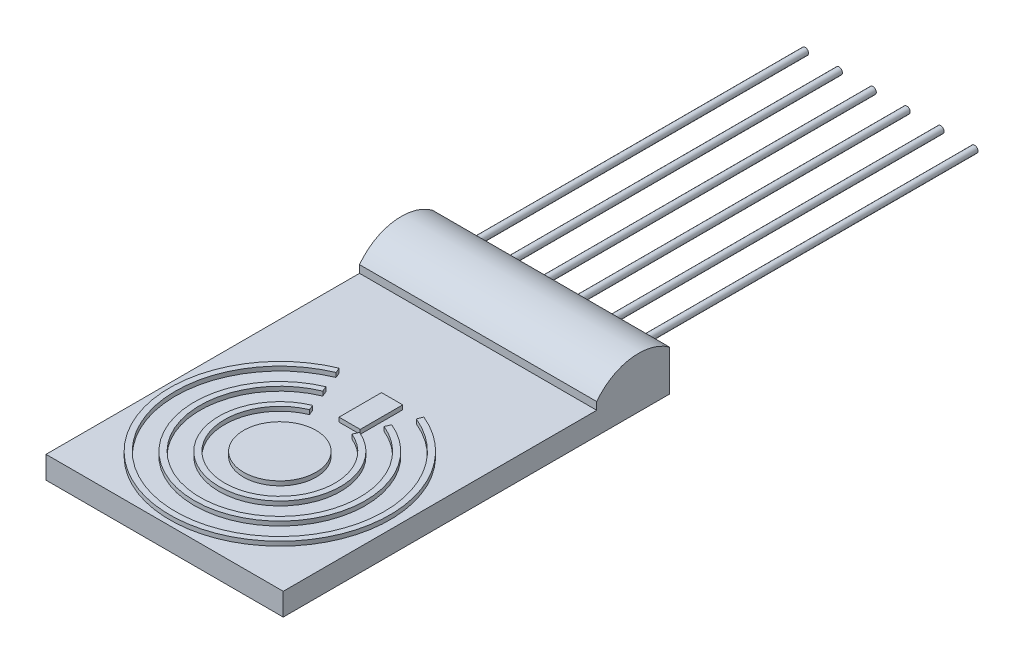
ISO-10303-21;
HEADER;
FILE_DESCRIPTION(('STEP AP214'),'2;1');
FILE_NAME('part.step','',(''),(''),'','','');
FILE_SCHEMA(('AUTOMOTIVE_DESIGN { 1 0 10303 214 1 1 1 1 }'));
ENDSEC;
DATA;
#1=APPLICATION_CONTEXT('core data for automotive mechanical design processes');
#2=APPLICATION_PROTOCOL_DEFINITION('international standard','automotive_design',2000,#1);
#3=PRODUCT_CONTEXT('',#1,'mechanical');
#4=PRODUCT('Part','Part','',(#3));
#5=PRODUCT_RELATED_PRODUCT_CATEGORY('part','',(#4));
#6=PRODUCT_DEFINITION_FORMATION('','',#4);
#7=PRODUCT_DEFINITION_CONTEXT('part definition',#1,'design');
#8=PRODUCT_DEFINITION('design','',#6,#7);
#9=PRODUCT_DEFINITION_SHAPE('','',#8);
#10=(LENGTH_UNIT() NAMED_UNIT(*) SI_UNIT(.MILLI.,.METRE.));
#11=(NAMED_UNIT(*) PLANE_ANGLE_UNIT() SI_UNIT($,.RADIAN.));
#12=(NAMED_UNIT(*) SI_UNIT($,.STERADIAN.) SOLID_ANGLE_UNIT());
#13=UNCERTAINTY_MEASURE_WITH_UNIT(LENGTH_MEASURE(1.E-05),#10,'distance_accuracy_value','');
#14=(GEOMETRIC_REPRESENTATION_CONTEXT(3) GLOBAL_UNCERTAINTY_ASSIGNED_CONTEXT((#13)) GLOBAL_UNIT_ASSIGNED_CONTEXT((#10,
#11,#12)) REPRESENTATION_CONTEXT('',''));
#15=CARTESIAN_POINT('',(0.,0.,0.));
#16=DIRECTION('',(0.,0.,1.));
#17=DIRECTION('',(1.,0.,0.));
#18=AXIS2_PLACEMENT_3D('',#15,#16,#17);
#19=CARTESIAN_POINT('',(0.,0.6604,0.));
#20=DIRECTION('',(0.,1.,0.));
#21=DIRECTION('',(0.,0.,1.));
#22=AXIS2_PLACEMENT_3D('',#19,#20,#21);
#23=PLANE('',#22);
#24=CARTESIAN_POINT('',(0.,0.6604,-3.4));
#25=DIRECTION('',(0.,1.,0.));
#26=DIRECTION('',(0.,0.,1.));
#27=AXIS2_PLACEMENT_3D('',#24,#25,#26);
#28=CIRCLE('',#27,1.07);
#29=CARTESIAN_POINT('',(0.,0.6604,-2.33));
#30=VERTEX_POINT('',#29);
#31=EDGE_CURVE('E300',#30,#30,#28,.T.);
#32=ORIENTED_EDGE('',*,*,#31,.F.);
#33=EDGE_LOOP('',(#32));
#34=FACE_BOUND('',#33,.T.);
#35=DIRECTION('',(0.,0.,-1.));
#36=VECTOR('',#35,1.);
#37=CARTESIAN_POINT('',(3.5,0.6604,-11.4));
#38=LINE('',#37,#36);
#39=CARTESIAN_POINT('',(3.5,0.6604,0.));
#40=VERTEX_POINT('',#39);
#41=CARTESIAN_POINT('',(3.5,0.6604,-9.25));
#42=VERTEX_POINT('',#41);
#43=EDGE_CURVE('E330',#40,#42,#38,.T.);
#44=ORIENTED_EDGE('',*,*,#43,.T.);
#45=DIRECTION('',(-1.,0.,0.));
#46=VECTOR('',#45,1.);
#47=CARTESIAN_POINT('',(5.80812221513507,0.6604,-9.25));
#48=LINE('',#47,#46);
#49=CARTESIAN_POINT('',(-3.5,0.6604,-9.25));
#50=VERTEX_POINT('',#49);
#51=EDGE_CURVE('E316',#42,#50,#48,.T.);
#52=ORIENTED_EDGE('',*,*,#51,.T.);
#53=DIRECTION('',(0.,0.,1.));
#54=VECTOR('',#53,1.);
#55=CARTESIAN_POINT('',(-3.5,0.6604,-11.4));
#56=LINE('',#55,#54);
#57=CARTESIAN_POINT('',(-3.5,0.6604,0.));
#58=VERTEX_POINT('',#57);
#59=EDGE_CURVE('E325',#50,#58,#56,.T.);
#60=ORIENTED_EDGE('',*,*,#59,.T.);
#61=DIRECTION('',(1.,0.,0.));
#62=VECTOR('',#61,1.);
#63=CARTESIAN_POINT('',(-3.5,0.6604,0.));
#64=LINE('',#63,#62);
#65=EDGE_CURVE('E327',#58,#40,#64,.T.);
#66=ORIENTED_EDGE('',*,*,#65,.T.);
#67=EDGE_LOOP('',(#44,#52,#60,#66));
#68=FACE_BOUND('',#67,.T.);
#69=DIRECTION('',(-0.384615384615385,0.,-0.923076923076923));
#70=VECTOR('',#69,1.);
#71=CARTESIAN_POINT('',(-0.625641058717949,0.6604,-4.90153854092308));
#72=LINE('',#71,#70);
#73=CARTESIAN_POINT('',(-0.625641058717949,0.6604,-4.90153854092308));
#74=VERTEX_POINT('',#73);
#75=CARTESIAN_POINT('',(-0.691025641025641,0.6604,-5.05846153846154));
#76=VERTEX_POINT('',#75);
#77=EDGE_CURVE('E285',#74,#76,#72,.T.);
#78=ORIENTED_EDGE('',*,*,#77,.F.);
#79=CARTESIAN_POINT('',(0.,0.6604,-3.4));
#80=DIRECTION('',(0.,-1.,0.));
#81=DIRECTION('',(0.,0.,1.));
#82=AXIS2_PLACEMENT_3D('',#79,#80,#81);
#83=CIRCLE('',#82,1.62666675266667);
#84=CARTESIAN_POINT('',(0.625641058717949,0.6604,-4.90153854092308));
#85=VERTEX_POINT('',#84);
#86=EDGE_CURVE('E271',#85,#74,#83,.T.);
#87=ORIENTED_EDGE('',*,*,#86,.F.);
#88=DIRECTION('',(-0.384615384615385,0.,0.923076923076923));
#89=VECTOR('',#88,1.);
#90=CARTESIAN_POINT('',(0.625641058717949,0.6604,-4.90153854092308));
#91=LINE('',#90,#89);
#92=CARTESIAN_POINT('',(0.691025641025641,0.6604,-5.05846153846154));
#93=VERTEX_POINT('',#92);
#94=EDGE_CURVE('E276',#93,#85,#91,.T.);
#95=ORIENTED_EDGE('',*,*,#94,.F.);
#96=CARTESIAN_POINT('',(0.,0.6604,-3.4));
#97=DIRECTION('',(0.,1.,0.));
#98=DIRECTION('',(0.,0.,1.));
#99=AXIS2_PLACEMENT_3D('',#96,#97,#98);
#100=CIRCLE('',#99,1.79666666666667);
#101=EDGE_CURVE('E287',#76,#93,#100,.T.);
#102=ORIENTED_EDGE('',*,*,#101,.F.);
#103=EDGE_LOOP('',(#78,#87,#95,#102));
#104=FACE_BOUND('',#103,.T.);
#105=DIRECTION('',(-0.384615384615382,0.,-0.923076923076924));
#106=VECTOR('',#105,1.);
#107=CARTESIAN_POINT('',(-0.905128238205129,0.6604,-5.57230777169231));
#108=LINE('',#107,#106);
#109=CARTESIAN_POINT('',(-0.905128238205129,0.6604,-5.57230777169231));
#110=VERTEX_POINT('',#109);
#111=CARTESIAN_POINT('',(-0.970512820512821,0.6604,-5.72923076923077));
#112=VERTEX_POINT('',#111);
#113=EDGE_CURVE('E256',#110,#112,#108,.T.);
#114=ORIENTED_EDGE('',*,*,#113,.F.);
#115=CARTESIAN_POINT('',(0.,0.6604,-3.4));
#116=DIRECTION('',(0.,-1.,0.));
#117=DIRECTION('',(0.,0.,1.));
#118=AXIS2_PLACEMENT_3D('',#115,#116,#117);
#119=CIRCLE('',#118,2.35333341933333);
#120=CARTESIAN_POINT('',(0.905128238205129,0.6604,-5.57230777169231));
#121=VERTEX_POINT('',#120);
#122=EDGE_CURVE('E242',#121,#110,#119,.T.);
#123=ORIENTED_EDGE('',*,*,#122,.F.);
#124=DIRECTION('',(-0.384615384615383,0.,0.923076923076924));
#125=VECTOR('',#124,1.);
#126=CARTESIAN_POINT('',(0.905128238205129,0.6604,-5.57230777169231));
#127=LINE('',#126,#125);
#128=CARTESIAN_POINT('',(0.970512820512821,0.6604,-5.72923076923077));
#129=VERTEX_POINT('',#128);
#130=EDGE_CURVE('E247',#129,#121,#127,.T.);
#131=ORIENTED_EDGE('',*,*,#130,.F.);
#132=CARTESIAN_POINT('',(0.,0.6604,-3.4));
#133=DIRECTION('',(0.,1.,0.));
#134=DIRECTION('',(0.,0.,1.));
#135=AXIS2_PLACEMENT_3D('',#132,#133,#134);
#136=CIRCLE('',#135,2.52333333333333);
#137=EDGE_CURVE('E258',#112,#129,#136,.T.);
#138=ORIENTED_EDGE('',*,*,#137,.F.);
#139=EDGE_LOOP('',(#114,#123,#131,#138));
#140=FACE_BOUND('',#139,.T.);
#141=DIRECTION('',(-0.384615384615382,0.,-0.923076923076924));
#142=VECTOR('',#141,1.);
#143=CARTESIAN_POINT('',(-1.18461541769231,0.6604,-6.24307700246154));
#144=LINE('',#143,#142);
#145=CARTESIAN_POINT('',(-1.18461541769231,0.6604,-6.24307700246154));
#146=VERTEX_POINT('',#145);
#147=CARTESIAN_POINT('',(-1.25,0.6604,-6.4));
#148=VERTEX_POINT('',#147);
#149=EDGE_CURVE('E214',#146,#148,#144,.T.);
#150=ORIENTED_EDGE('',*,*,#149,.F.);
#151=CARTESIAN_POINT('',(0.,0.6604,-3.4));
#152=DIRECTION('',(0.,-1.,0.));
#153=DIRECTION('',(0.,0.,1.));
#154=AXIS2_PLACEMENT_3D('',#151,#152,#153);
#155=CIRCLE('',#154,3.080000086);
#156=CARTESIAN_POINT('',(1.18461541769231,0.6604,-6.24307700246154));
#157=VERTEX_POINT('',#156);
#158=EDGE_CURVE('E211',#157,#146,#155,.T.);
#159=ORIENTED_EDGE('',*,*,#158,.F.);
#160=DIRECTION('',(-0.384615384615384,0.,0.923076923076923));
#161=VECTOR('',#160,1.);
#162=CARTESIAN_POINT('',(1.18461541769231,0.6604,-6.24307700246154));
#163=LINE('',#162,#161);
#164=CARTESIAN_POINT('',(1.25,0.6604,-6.4));
#165=VERTEX_POINT('',#164);
#166=EDGE_CURVE('E223',#165,#157,#163,.T.);
#167=ORIENTED_EDGE('',*,*,#166,.F.);
#168=CARTESIAN_POINT('',(0.,0.6604,-3.4));
#169=DIRECTION('',(0.,1.,0.));
#170=DIRECTION('',(0.,0.,1.));
#171=AXIS2_PLACEMENT_3D('',#168,#169,#170);
#172=CIRCLE('',#171,3.25);
#173=EDGE_CURVE('E231',#148,#165,#172,.T.);
#174=ORIENTED_EDGE('',*,*,#173,.F.);
#175=EDGE_LOOP('',(#150,#159,#167,#174));
#176=FACE_BOUND('',#175,.T.);
#177=DIRECTION('',(1.,0.,0.));
#178=VECTOR('',#177,1.);
#179=CARTESIAN_POINT('',(0.,0.6604,-5.14588991340849));
#180=LINE('',#179,#178);
#181=CARTESIAN_POINT('',(0.,0.6604,-5.14588991340849));
#182=VERTEX_POINT('',#181);
#183=CARTESIAN_POINT('',(0.625641058717949,0.6604,-5.14588991340849));
#184=VERTEX_POINT('',#183);
#185=EDGE_CURVE('E583',#182,#184,#180,.T.);
#186=ORIENTED_EDGE('',*,*,#185,.F.);
#187=DIRECTION('',(0.,0.,1.));
#188=VECTOR('',#187,1.);
#189=CARTESIAN_POINT('',(0.,0.6604,-6.4));
#190=LINE('',#189,#188);
#191=CARTESIAN_POINT('',(0.,0.6604,-6.4));
#192=VERTEX_POINT('',#191);
#193=EDGE_CURVE('E209',#192,#182,#190,.T.);
#194=ORIENTED_EDGE('',*,*,#193,.F.);
#195=DIRECTION('',(-1.,0.,0.));
#196=VECTOR('',#195,1.);
#197=CARTESIAN_POINT('',(0.,0.6604,-6.4));
#198=LINE('',#197,#196);
#199=CARTESIAN_POINT('',(0.625641058717949,0.6604,-6.4));
#200=VERTEX_POINT('',#199);
#201=EDGE_CURVE('E205',#200,#192,#198,.T.);
#202=ORIENTED_EDGE('',*,*,#201,.F.);
#203=DIRECTION('',(0.,0.,-1.));
#204=VECTOR('',#203,1.);
#205=CARTESIAN_POINT('',(0.625641058717949,0.6604,-6.4));
#206=LINE('',#205,#204);
#207=EDGE_CURVE('E585',#184,#200,#206,.T.);
#208=ORIENTED_EDGE('',*,*,#207,.F.);
#209=EDGE_LOOP('',(#186,#194,#202,#208));
#210=FACE_BOUND('',#209,.T.);
#211=ADVANCED_FACE('F36',(#34,#68,#104,#140,#176,#210),#23,.T.);
#212=CARTESIAN_POINT('',(-3.5,0.6604,-11.4));
#213=DIRECTION('',(1.,0.,0.));
#214=DIRECTION('',(0.,0.,-1.));
#215=AXIS2_PLACEMENT_3D('',#212,#213,#214);
#216=PLANE('',#215);
#217=DIRECTION('',(0.,0.,1.));
#218=VECTOR('',#217,1.);
#219=CARTESIAN_POINT('',(-3.5,0.,-11.4));
#220=LINE('',#219,#218);
#221=CARTESIAN_POINT('',(-3.5,0.,-11.4));
#222=VERTEX_POINT('',#221);
#223=CARTESIAN_POINT('',(-3.5,0.,0.));
#224=VERTEX_POINT('',#223);
#225=EDGE_CURVE('E324',#222,#224,#220,.T.);
#226=ORIENTED_EDGE('',*,*,#225,.T.);
#227=DIRECTION('',(0.,-1.,0.));
#228=VECTOR('',#227,1.);
#229=CARTESIAN_POINT('',(-3.5,0.6604,0.));
#230=LINE('',#229,#228);
#231=EDGE_CURVE('E349',#58,#224,#230,.T.);
#232=ORIENTED_EDGE('',*,*,#231,.F.);
#233=ORIENTED_EDGE('',*,*,#59,.F.);
#234=DIRECTION('',(0.,1.,0.));
#235=VECTOR('',#234,1.);
#236=CARTESIAN_POINT('',(-3.5,0.6604,-9.25));
#237=LINE('',#236,#235);
#238=CARTESIAN_POINT('',(-3.5,0.88367644167775,-9.25));
#239=VERTEX_POINT('',#238);
#240=EDGE_CURVE('E304',#50,#239,#237,.T.);
#241=ORIENTED_EDGE('',*,*,#240,.T.);
#242=CARTESIAN_POINT('',(-3.5,-0.045461998302742,-10.4849714764109));
#243=DIRECTION('',(-1.,0.,0.));
#244=DIRECTION('',(0.,0.,-1.));
#245=AXIS2_PLACEMENT_3D('',#242,#243,#244);
#246=CIRCLE('',#245,1.54546199830274);
#247=CARTESIAN_POINT('',(-3.5,1.2,-11.4));
#248=VERTEX_POINT('',#247);
#249=EDGE_CURVE('E313',#239,#248,#246,.T.);
#250=ORIENTED_EDGE('',*,*,#249,.T.);
#251=DIRECTION('',(0.,-1.,0.));
#252=VECTOR('',#251,1.);
#253=CARTESIAN_POINT('',(-3.5,0.6604,-11.4));
#254=LINE('',#253,#252);
#255=EDGE_CURVE('E333',#248,#222,#254,.T.);
#256=ORIENTED_EDGE('',*,*,#255,.T.);
#257=EDGE_LOOP('',(#226,#232,#233,#241,#250,#256));
#258=FACE_BOUND('',#257,.T.);
#259=ADVANCED_FACE('F38',(#258),#216,.F.);
#260=CARTESIAN_POINT('',(-3.5,0.6604,0.));
#261=DIRECTION('',(0.,0.,-1.));
#262=DIRECTION('',(-1.,0.,0.));
#263=AXIS2_PLACEMENT_3D('',#260,#261,#262);
#264=PLANE('',#263);
#265=DIRECTION('',(1.,0.,0.));
#266=VECTOR('',#265,1.);
#267=CARTESIAN_POINT('',(-3.5,0.,0.));
#268=LINE('',#267,#266);
#269=CARTESIAN_POINT('',(3.5,0.,0.));
#270=VERTEX_POINT('',#269);
#271=EDGE_CURVE('E336',#224,#270,#268,.T.);
#272=ORIENTED_EDGE('',*,*,#271,.T.);
#273=DIRECTION('',(0.,-1.,0.));
#274=VECTOR('',#273,1.);
#275=CARTESIAN_POINT('',(3.5,0.6604,0.));
#276=LINE('',#275,#274);
#277=EDGE_CURVE('E346',#40,#270,#276,.T.);
#278=ORIENTED_EDGE('',*,*,#277,.F.);
#279=ORIENTED_EDGE('',*,*,#65,.F.);
#280=ORIENTED_EDGE('',*,*,#231,.T.);
#281=EDGE_LOOP('',(#272,#278,#279,#280));
#282=FACE_BOUND('',#281,.T.);
#283=ADVANCED_FACE('F394',(#282),#264,.F.);
#284=CARTESIAN_POINT('',(3.5,0.6604,-11.4));
#285=DIRECTION('',(-1.,0.,0.));
#286=DIRECTION('',(0.,0.,1.));
#287=AXIS2_PLACEMENT_3D('',#284,#285,#286);
#288=PLANE('',#287);
#289=DIRECTION('',(0.,0.,-1.));
#290=VECTOR('',#289,1.);
#291=CARTESIAN_POINT('',(3.5,0.,-11.4));
#292=LINE('',#291,#290);
#293=CARTESIAN_POINT('',(3.5,0.,-11.4));
#294=VERTEX_POINT('',#293);
#295=EDGE_CURVE('E338',#270,#294,#292,.T.);
#296=ORIENTED_EDGE('',*,*,#295,.T.);
#297=DIRECTION('',(0.,-1.,0.));
#298=VECTOR('',#297,1.);
#299=CARTESIAN_POINT('',(3.5,0.6604,-11.4));
#300=LINE('',#299,#298);
#301=CARTESIAN_POINT('',(3.5,1.2,-11.4));
#302=VERTEX_POINT('',#301);
#303=EDGE_CURVE('E343',#302,#294,#300,.T.);
#304=ORIENTED_EDGE('',*,*,#303,.F.);
#305=CARTESIAN_POINT('',(3.5,-0.045461998302742,-10.4849714764109));
#306=DIRECTION('',(-1.,0.,0.));
#307=DIRECTION('',(0.,0.,1.));
#308=AXIS2_PLACEMENT_3D('',#305,#306,#307);
#309=CIRCLE('',#308,1.54546199830274);
#310=CARTESIAN_POINT('',(3.5,0.88367644167775,-9.25));
#311=VERTEX_POINT('',#310);
#312=EDGE_CURVE('E307',#302,#311,#309,.F.);
#313=ORIENTED_EDGE('',*,*,#312,.T.);
#314=DIRECTION('',(0.,-1.,0.));
#315=VECTOR('',#314,1.);
#316=CARTESIAN_POINT('',(3.5,0.6604,-9.25));
#317=LINE('',#316,#315);
#318=EDGE_CURVE('E309',#311,#42,#317,.T.);
#319=ORIENTED_EDGE('',*,*,#318,.T.);
#320=ORIENTED_EDGE('',*,*,#43,.F.);
#321=ORIENTED_EDGE('',*,*,#277,.T.);
#322=EDGE_LOOP('',(#296,#304,#313,#319,#320,#321));
#323=FACE_BOUND('',#322,.T.);
#324=ADVANCED_FACE('F372',(#323),#288,.F.);
#325=CARTESIAN_POINT('',(-3.5,0.6604,-11.4));
#326=DIRECTION('',(0.,0.,1.));
#327=DIRECTION('',(1.,0.,0.));
#328=AXIS2_PLACEMENT_3D('',#325,#326,#327);
#329=PLANE('',#328);
#330=CARTESIAN_POINT('',(-2.5,0.7604,-11.4));
#331=DIRECTION('',(0.,0.,1.));
#332=DIRECTION('',(1.,0.,0.));
#333=AXIS2_PLACEMENT_3D('',#330,#331,#332);
#334=CIRCLE('',#333,0.0999999999999999);
#335=CARTESIAN_POINT('',(-2.4,0.7604,-11.4));
#336=VERTEX_POINT('',#335);
#337=EDGE_CURVE('E11',#336,#336,#334,.F.);
#338=ORIENTED_EDGE('',*,*,#337,.F.);
#339=EDGE_LOOP('',(#338));
#340=FACE_BOUND('',#339,.T.);
#341=CARTESIAN_POINT('',(-1.5,0.7604,-11.4));
#342=DIRECTION('',(0.,0.,1.));
#343=DIRECTION('',(1.,0.,0.));
#344=AXIS2_PLACEMENT_3D('',#341,#342,#343);
#345=CIRCLE('',#344,0.1);
#346=CARTESIAN_POINT('',(-1.4,0.7604,-11.4));
#347=VERTEX_POINT('',#346);
#348=EDGE_CURVE('E44',#347,#347,#345,.F.);
#349=ORIENTED_EDGE('',*,*,#348,.F.);
#350=EDGE_LOOP('',(#349));
#351=FACE_BOUND('',#350,.T.);
#352=CARTESIAN_POINT('',(-0.5,0.7604,-11.4));
#353=DIRECTION('',(0.,0.,1.));
#354=DIRECTION('',(1.,0.,0.));
#355=AXIS2_PLACEMENT_3D('',#352,#353,#354);
#356=CIRCLE('',#355,0.1);
#357=CARTESIAN_POINT('',(-0.4,0.7604,-11.4));
#358=VERTEX_POINT('',#357);
#359=EDGE_CURVE('E361',#358,#358,#356,.F.);
#360=ORIENTED_EDGE('',*,*,#359,.F.);
#361=EDGE_LOOP('',(#360));
#362=FACE_BOUND('',#361,.T.);
#363=CARTESIAN_POINT('',(0.5,0.7604,-11.4));
#364=DIRECTION('',(0.,0.,1.));
#365=DIRECTION('',(1.,0.,0.));
#366=AXIS2_PLACEMENT_3D('',#363,#364,#365);
#367=CIRCLE('',#366,0.1);
#368=CARTESIAN_POINT('',(0.6,0.7604,-11.4));
#369=VERTEX_POINT('',#368);
#370=EDGE_CURVE('E358',#369,#369,#367,.F.);
#371=ORIENTED_EDGE('',*,*,#370,.F.);
#372=EDGE_LOOP('',(#371));
#373=FACE_BOUND('',#372,.T.);
#374=CARTESIAN_POINT('',(1.5,0.7604,-11.4));
#375=DIRECTION('',(0.,0.,1.));
#376=DIRECTION('',(1.,0.,0.));
#377=AXIS2_PLACEMENT_3D('',#374,#375,#376);
#378=CIRCLE('',#377,0.1);
#379=CARTESIAN_POINT('',(1.6,0.7604,-11.4));
#380=VERTEX_POINT('',#379);
#381=EDGE_CURVE('E355',#380,#380,#378,.F.);
#382=ORIENTED_EDGE('',*,*,#381,.F.);
#383=EDGE_LOOP('',(#382));
#384=FACE_BOUND('',#383,.T.);
#385=CARTESIAN_POINT('',(2.5,0.7604,-11.4));
#386=DIRECTION('',(0.,0.,1.));
#387=DIRECTION('',(1.,0.,0.));
#388=AXIS2_PLACEMENT_3D('',#385,#386,#387);
#389=CIRCLE('',#388,0.0999999999999999);
#390=CARTESIAN_POINT('',(2.6,0.7604,-11.4));
#391=VERTEX_POINT('',#390);
#392=EDGE_CURVE('E352',#391,#391,#389,.F.);
#393=ORIENTED_EDGE('',*,*,#392,.F.);
#394=EDGE_LOOP('',(#393));
#395=FACE_BOUND('',#394,.T.);
#396=DIRECTION('',(-1.,0.,0.));
#397=VECTOR('',#396,1.);
#398=CARTESIAN_POINT('',(-3.5,0.,-11.4));
#399=LINE('',#398,#397);
#400=EDGE_CURVE('E328',#294,#222,#399,.T.);
#401=ORIENTED_EDGE('',*,*,#400,.T.);
#402=ORIENTED_EDGE('',*,*,#255,.F.);
#403=DIRECTION('',(-1.,0.,0.));
#404=VECTOR('',#403,1.);
#405=CARTESIAN_POINT('',(5.80812221513507,1.2,-11.4));
#406=LINE('',#405,#404);
#407=EDGE_CURVE('E310',#302,#248,#406,.T.);
#408=ORIENTED_EDGE('',*,*,#407,.F.);
#409=ORIENTED_EDGE('',*,*,#303,.T.);
#410=EDGE_LOOP('',(#401,#402,#408,#409));
#411=FACE_BOUND('',#410,.T.);
#412=ADVANCED_FACE('F368',(#340,#351,#362,#373,#384,#395,#411),#329,.F.);
#413=CARTESIAN_POINT('',(0.,0.,0.));
#414=DIRECTION('',(0.,1.,0.));
#415=DIRECTION('',(0.,0.,1.));
#416=AXIS2_PLACEMENT_3D('',#413,#414,#415);
#417=PLANE('',#416);
#418=ORIENTED_EDGE('',*,*,#225,.F.);
#419=ORIENTED_EDGE('',*,*,#400,.F.);
#420=ORIENTED_EDGE('',*,*,#295,.F.);
#421=ORIENTED_EDGE('',*,*,#271,.F.);
#422=EDGE_LOOP('',(#418,#419,#420,#421));
#423=FACE_BOUND('',#422,.T.);
#424=ADVANCED_FACE('F371',(#423),#417,.F.);
#425=CARTESIAN_POINT('',(5.80812221513507,-0.045461998302742,-10.4849714764109));
#426=DIRECTION('',(-1.,0.,0.));
#427=DIRECTION('',(0.,0.,1.));
#428=AXIS2_PLACEMENT_3D('',#425,#426,#427);
#429=CYLINDRICAL_SURFACE('',#428,1.54546199830274);
#430=ORIENTED_EDGE('',*,*,#312,.F.);
#431=ORIENTED_EDGE('',*,*,#407,.T.);
#432=ORIENTED_EDGE('',*,*,#249,.F.);
#433=DIRECTION('',(-1.,0.,0.));
#434=VECTOR('',#433,1.);
#435=CARTESIAN_POINT('',(5.80812221513507,0.88367644167775,-9.25));
#436=LINE('',#435,#434);
#437=EDGE_CURVE('E319',#311,#239,#436,.T.);
#438=ORIENTED_EDGE('',*,*,#437,.F.);
#439=EDGE_LOOP('',(#430,#431,#432,#438));
#440=FACE_BOUND('',#439,.T.);
#441=ADVANCED_FACE('F406',(#440),#429,.T.);
#442=CARTESIAN_POINT('',(5.80812221513507,0.6604,-9.25));
#443=DIRECTION('',(0.,0.,1.));
#444=DIRECTION('',(1.,0.,0.));
#445=AXIS2_PLACEMENT_3D('',#442,#443,#444);
#446=PLANE('',#445);
#447=ORIENTED_EDGE('',*,*,#318,.F.);
#448=ORIENTED_EDGE('',*,*,#437,.T.);
#449=ORIENTED_EDGE('',*,*,#240,.F.);
#450=ORIENTED_EDGE('',*,*,#51,.F.);
#451=EDGE_LOOP('',(#447,#448,#449,#450));
#452=FACE_BOUND('',#451,.T.);
#453=ADVANCED_FACE('F402',(#452),#446,.T.);
#454=CARTESIAN_POINT('',(0.,0.7874,-3.4));
#455=DIRECTION('',(0.,-1.,0.));
#456=DIRECTION('',(0.,0.,-1.));
#457=AXIS2_PLACEMENT_3D('',#454,#455,#456);
#458=CYLINDRICAL_SURFACE('',#457,1.07);
#459=CARTESIAN_POINT('',(0.,0.7874,-3.4));
#460=DIRECTION('',(0.,1.,0.));
#461=DIRECTION('',(0.,0.,1.));
#462=AXIS2_PLACEMENT_3D('',#459,#460,#461);
#463=CIRCLE('',#462,1.07);
#464=CARTESIAN_POINT('',(0.,0.7874,-2.33));
#465=VERTEX_POINT('',#464);
#466=EDGE_CURVE('E301',#465,#465,#463,.T.);
#467=ORIENTED_EDGE('',*,*,#466,.F.);
#468=EDGE_LOOP('',(#467));
#469=FACE_BOUND('',#468,.T.);
#470=ORIENTED_EDGE('',*,*,#31,.T.);
#471=EDGE_LOOP('',(#470));
#472=FACE_BOUND('',#471,.T.);
#473=ADVANCED_FACE('F430',(#469,#472),#458,.T.);
#474=CARTESIAN_POINT('',(0.,0.7874,-3.4));
#475=DIRECTION('',(0.,1.,0.));
#476=DIRECTION('',(0.,0.,1.));
#477=AXIS2_PLACEMENT_3D('',#474,#475,#476);
#478=PLANE('',#477);
#479=ORIENTED_EDGE('',*,*,#466,.T.);
#480=EDGE_LOOP('',(#479));
#481=FACE_BOUND('',#480,.T.);
#482=ADVANCED_FACE('F434',(#481),#478,.T.);
#483=CARTESIAN_POINT('',(0.,0.7874,-3.4));
#484=DIRECTION('',(0.,-1.,0.));
#485=DIRECTION('',(0.,0.,-1.));
#486=AXIS2_PLACEMENT_3D('',#483,#484,#485);
#487=CYLINDRICAL_SURFACE('',#486,1.62666675266667);
#488=ORIENTED_EDGE('',*,*,#86,.T.);
#489=DIRECTION('',(0.,-1.,0.));
#490=VECTOR('',#489,1.);
#491=CARTESIAN_POINT('',(-0.625641058717949,0.7874,-4.90153854092308));
#492=LINE('',#491,#490);
#493=CARTESIAN_POINT('',(-0.625641058717949,0.7874,-4.90153854092308));
#494=VERTEX_POINT('',#493);
#495=EDGE_CURVE('E298',#494,#74,#492,.T.);
#496=ORIENTED_EDGE('',*,*,#495,.F.);
#497=CARTESIAN_POINT('',(0.,0.7874,-3.4));
#498=DIRECTION('',(0.,-1.,0.));
#499=DIRECTION('',(0.,0.,1.));
#500=AXIS2_PLACEMENT_3D('',#497,#498,#499);
#501=CIRCLE('',#500,1.62666675266667);
#502=CARTESIAN_POINT('',(0.625641058717949,0.7874,-4.90153854092308));
#503=VERTEX_POINT('',#502);
#504=EDGE_CURVE('E272',#503,#494,#501,.T.);
#505=ORIENTED_EDGE('',*,*,#504,.F.);
#506=DIRECTION('',(0.,-1.,0.));
#507=VECTOR('',#506,1.);
#508=CARTESIAN_POINT('',(0.625641058717949,0.7874,-4.90153854092308));
#509=LINE('',#508,#507);
#510=EDGE_CURVE('E282',#503,#85,#509,.T.);
#511=ORIENTED_EDGE('',*,*,#510,.T.);
#512=EDGE_LOOP('',(#488,#496,#505,#511));
#513=FACE_BOUND('',#512,.T.);
#514=ADVANCED_FACE('F438',(#513),#487,.F.);
#515=CARTESIAN_POINT('',(-0.625641058717949,0.7874,-4.90153854092308));
#516=DIRECTION('',(-0.923076923076923,0.,0.384615384615385));
#517=DIRECTION('',(0.384615384615385,0.,0.923076923076923));
#518=AXIS2_PLACEMENT_3D('',#515,#516,#517);
#519=PLANE('',#518);
#520=ORIENTED_EDGE('',*,*,#77,.T.);
#521=DIRECTION('',(0.,-1.,0.));
#522=VECTOR('',#521,1.);
#523=CARTESIAN_POINT('',(-0.691025641025641,0.7874,-5.05846153846154));
#524=LINE('',#523,#522);
#525=CARTESIAN_POINT('',(-0.691025641025641,0.7874,-5.05846153846154));
#526=VERTEX_POINT('',#525);
#527=EDGE_CURVE('E295',#526,#76,#524,.T.);
#528=ORIENTED_EDGE('',*,*,#527,.F.);
#529=DIRECTION('',(-0.384615384615385,0.,-0.923076923076923));
#530=VECTOR('',#529,1.);
#531=CARTESIAN_POINT('',(-0.625641058717949,0.7874,-4.90153854092308));
#532=LINE('',#531,#530);
#533=EDGE_CURVE('E275',#494,#526,#532,.T.);
#534=ORIENTED_EDGE('',*,*,#533,.F.);
#535=ORIENTED_EDGE('',*,*,#495,.T.);
#536=EDGE_LOOP('',(#520,#528,#534,#535));
#537=FACE_BOUND('',#536,.T.);
#538=ADVANCED_FACE('F442',(#537),#519,.F.);
#539=CARTESIAN_POINT('',(0.,0.7874,-3.4));
#540=DIRECTION('',(0.,-1.,0.));
#541=DIRECTION('',(0.,0.,-1.));
#542=AXIS2_PLACEMENT_3D('',#539,#540,#541);
#543=CYLINDRICAL_SURFACE('',#542,1.79666666666667);
#544=ORIENTED_EDGE('',*,*,#101,.T.);
#545=DIRECTION('',(0.,-1.,0.));
#546=VECTOR('',#545,1.);
#547=CARTESIAN_POINT('',(0.691025641025641,0.7874,-5.05846153846154));
#548=LINE('',#547,#546);
#549=CARTESIAN_POINT('',(0.691025641025641,0.7874,-5.05846153846154));
#550=VERTEX_POINT('',#549);
#551=EDGE_CURVE('E293',#550,#93,#548,.T.);
#552=ORIENTED_EDGE('',*,*,#551,.F.);
#553=CARTESIAN_POINT('',(0.,0.7874,-3.4));
#554=DIRECTION('',(0.,1.,0.));
#555=DIRECTION('',(0.,0.,1.));
#556=AXIS2_PLACEMENT_3D('',#553,#554,#555);
#557=CIRCLE('',#556,1.79666666666667);
#558=EDGE_CURVE('E278',#526,#550,#557,.T.);
#559=ORIENTED_EDGE('',*,*,#558,.F.);
#560=ORIENTED_EDGE('',*,*,#527,.T.);
#561=EDGE_LOOP('',(#544,#552,#559,#560));
#562=FACE_BOUND('',#561,.T.);
#563=ADVANCED_FACE('F446',(#562),#543,.T.);
#564=CARTESIAN_POINT('',(0.625641058717949,0.7874,-4.90153854092308));
#565=DIRECTION('',(0.923076923076923,0.,0.384615384615385));
#566=DIRECTION('',(0.384615384615385,0.,-0.923076923076923));
#567=AXIS2_PLACEMENT_3D('',#564,#565,#566);
#568=PLANE('',#567);
#569=ORIENTED_EDGE('',*,*,#94,.T.);
#570=ORIENTED_EDGE('',*,*,#510,.F.);
#571=DIRECTION('',(-0.384615384615385,0.,0.923076923076923));
#572=VECTOR('',#571,1.);
#573=CARTESIAN_POINT('',(0.625641058717949,0.7874,-4.90153854092308));
#574=LINE('',#573,#572);
#575=EDGE_CURVE('E280',#550,#503,#574,.T.);
#576=ORIENTED_EDGE('',*,*,#575,.F.);
#577=ORIENTED_EDGE('',*,*,#551,.T.);
#578=EDGE_LOOP('',(#569,#570,#576,#577));
#579=FACE_BOUND('',#578,.T.);
#580=ADVANCED_FACE('F450',(#579),#568,.F.);
#581=CARTESIAN_POINT('',(0.,0.7874,-3.4));
#582=DIRECTION('',(0.,1.,0.));
#583=DIRECTION('',(0.,0.,1.));
#584=AXIS2_PLACEMENT_3D('',#581,#582,#583);
#585=PLANE('',#584);
#586=ORIENTED_EDGE('',*,*,#504,.T.);
#587=ORIENTED_EDGE('',*,*,#533,.T.);
#588=ORIENTED_EDGE('',*,*,#558,.T.);
#589=ORIENTED_EDGE('',*,*,#575,.T.);
#590=EDGE_LOOP('',(#586,#587,#588,#589));
#591=FACE_BOUND('',#590,.T.);
#592=ADVANCED_FACE('F454',(#591),#585,.T.);
#593=CARTESIAN_POINT('',(0.,0.7874,-3.4));
#594=DIRECTION('',(0.,-1.,0.));
#595=DIRECTION('',(0.,0.,-1.));
#596=AXIS2_PLACEMENT_3D('',#593,#594,#595);
#597=CYLINDRICAL_SURFACE('',#596,2.35333341933333);
#598=ORIENTED_EDGE('',*,*,#122,.T.);
#599=DIRECTION('',(0.,-1.,0.));
#600=VECTOR('',#599,1.);
#601=CARTESIAN_POINT('',(-0.905128238205129,0.7874,-5.57230777169231));
#602=LINE('',#601,#600);
#603=CARTESIAN_POINT('',(-0.905128238205129,0.7874,-5.57230777169231));
#604=VERTEX_POINT('',#603);
#605=EDGE_CURVE('E269',#604,#110,#602,.T.);
#606=ORIENTED_EDGE('',*,*,#605,.F.);
#607=CARTESIAN_POINT('',(0.,0.7874,-3.4));
#608=DIRECTION('',(0.,-1.,0.));
#609=DIRECTION('',(0.,0.,1.));
#610=AXIS2_PLACEMENT_3D('',#607,#608,#609);
#611=CIRCLE('',#610,2.35333341933333);
#612=CARTESIAN_POINT('',(0.905128238205129,0.7874,-5.57230777169231));
#613=VERTEX_POINT('',#612);
#614=EDGE_CURVE('E243',#613,#604,#611,.T.);
#615=ORIENTED_EDGE('',*,*,#614,.F.);
#616=DIRECTION('',(0.,-1.,0.));
#617=VECTOR('',#616,1.);
#618=CARTESIAN_POINT('',(0.905128238205129,0.7874,-5.57230777169231));
#619=LINE('',#618,#617);
#620=EDGE_CURVE('E253',#613,#121,#619,.T.);
#621=ORIENTED_EDGE('',*,*,#620,.T.);
#622=EDGE_LOOP('',(#598,#606,#615,#621));
#623=FACE_BOUND('',#622,.T.);
#624=ADVANCED_FACE('F458',(#623),#597,.F.);
#625=CARTESIAN_POINT('',(-0.905128238205129,0.7874,-5.57230777169231));
#626=DIRECTION('',(-0.923076923076924,0.,0.384615384615382));
#627=DIRECTION('',(0.384615384615382,0.,0.923076923076924));
#628=AXIS2_PLACEMENT_3D('',#625,#626,#627);
#629=PLANE('',#628);
#630=ORIENTED_EDGE('',*,*,#113,.T.);
#631=DIRECTION('',(0.,-1.,0.));
#632=VECTOR('',#631,1.);
#633=CARTESIAN_POINT('',(-0.970512820512821,0.7874,-5.72923076923077));
#634=LINE('',#633,#632);
#635=CARTESIAN_POINT('',(-0.970512820512821,0.7874,-5.72923076923077));
#636=VERTEX_POINT('',#635);
#637=EDGE_CURVE('E266',#636,#112,#634,.T.);
#638=ORIENTED_EDGE('',*,*,#637,.F.);
#639=DIRECTION('',(-0.384615384615382,0.,-0.923076923076924));
#640=VECTOR('',#639,1.);
#641=CARTESIAN_POINT('',(-0.905128238205129,0.7874,-5.57230777169231));
#642=LINE('',#641,#640);
#643=EDGE_CURVE('E246',#604,#636,#642,.T.);
#644=ORIENTED_EDGE('',*,*,#643,.F.);
#645=ORIENTED_EDGE('',*,*,#605,.T.);
#646=EDGE_LOOP('',(#630,#638,#644,#645));
#647=FACE_BOUND('',#646,.T.);
#648=ADVANCED_FACE('F462',(#647),#629,.F.);
#649=CARTESIAN_POINT('',(0.,0.7874,-3.4));
#650=DIRECTION('',(0.,-1.,0.));
#651=DIRECTION('',(0.,0.,-1.));
#652=AXIS2_PLACEMENT_3D('',#649,#650,#651);
#653=CYLINDRICAL_SURFACE('',#652,2.52333333333333);
#654=ORIENTED_EDGE('',*,*,#137,.T.);
#655=DIRECTION('',(0.,-1.,0.));
#656=VECTOR('',#655,1.);
#657=CARTESIAN_POINT('',(0.970512820512819,0.7874,-5.72923076923077));
#658=LINE('',#657,#656);
#659=CARTESIAN_POINT('',(0.970512820512819,0.7874,-5.72923076923077));
#660=VERTEX_POINT('',#659);
#661=EDGE_CURVE('E264',#660,#129,#658,.T.);
#662=ORIENTED_EDGE('',*,*,#661,.F.);
#663=CARTESIAN_POINT('',(0.,0.7874,-3.4));
#664=DIRECTION('',(0.,1.,0.));
#665=DIRECTION('',(0.,0.,1.));
#666=AXIS2_PLACEMENT_3D('',#663,#664,#665);
#667=CIRCLE('',#666,2.52333333333333);
#668=EDGE_CURVE('E249',#636,#660,#667,.T.);
#669=ORIENTED_EDGE('',*,*,#668,.F.);
#670=ORIENTED_EDGE('',*,*,#637,.T.);
#671=EDGE_LOOP('',(#654,#662,#669,#670));
#672=FACE_BOUND('',#671,.T.);
#673=ADVANCED_FACE('F466',(#672),#653,.T.);
#674=CARTESIAN_POINT('',(0.905128238205129,0.7874,-5.57230777169231));
#675=DIRECTION('',(0.923076923076924,0.,0.384615384615383));
#676=DIRECTION('',(0.384615384615383,0.,-0.923076923076924));
#677=AXIS2_PLACEMENT_3D('',#674,#675,#676);
#678=PLANE('',#677);
#679=ORIENTED_EDGE('',*,*,#130,.T.);
#680=ORIENTED_EDGE('',*,*,#620,.F.);
#681=DIRECTION('',(-0.384615384615383,0.,0.923076923076924));
#682=VECTOR('',#681,1.);
#683=CARTESIAN_POINT('',(0.905128238205129,0.7874,-5.57230777169231));
#684=LINE('',#683,#682);
#685=EDGE_CURVE('E251',#660,#613,#684,.T.);
#686=ORIENTED_EDGE('',*,*,#685,.F.);
#687=ORIENTED_EDGE('',*,*,#661,.T.);
#688=EDGE_LOOP('',(#679,#680,#686,#687));
#689=FACE_BOUND('',#688,.T.);
#690=ADVANCED_FACE('F470',(#689),#678,.F.);
#691=CARTESIAN_POINT('',(0.,0.7874,-3.4));
#692=DIRECTION('',(0.,1.,0.));
#693=DIRECTION('',(0.,0.,1.));
#694=AXIS2_PLACEMENT_3D('',#691,#692,#693);
#695=PLANE('',#694);
#696=ORIENTED_EDGE('',*,*,#614,.T.);
#697=ORIENTED_EDGE('',*,*,#643,.T.);
#698=ORIENTED_EDGE('',*,*,#668,.T.);
#699=ORIENTED_EDGE('',*,*,#685,.T.);
#700=EDGE_LOOP('',(#696,#697,#698,#699));
#701=FACE_BOUND('',#700,.T.);
#702=ADVANCED_FACE('F474',(#701),#695,.T.);
#703=CARTESIAN_POINT('',(0.,0.7874,-3.4));
#704=DIRECTION('',(0.,-1.,0.));
#705=DIRECTION('',(0.,0.,-1.));
#706=AXIS2_PLACEMENT_3D('',#703,#704,#705);
#707=CYLINDRICAL_SURFACE('',#706,3.080000086);
#708=ORIENTED_EDGE('',*,*,#158,.T.);
#709=DIRECTION('',(0.,-1.,0.));
#710=VECTOR('',#709,1.);
#711=CARTESIAN_POINT('',(-1.18461541769231,0.7874,-6.24307700246154));
#712=LINE('',#711,#710);
#713=CARTESIAN_POINT('',(-1.18461541769231,0.7874,-6.24307700246154));
#714=VERTEX_POINT('',#713);
#715=EDGE_CURVE('E240',#714,#146,#712,.T.);
#716=ORIENTED_EDGE('',*,*,#715,.F.);
#717=CARTESIAN_POINT('',(0.,0.7874,-3.4));
#718=DIRECTION('',(0.,-1.,0.));
#719=DIRECTION('',(0.,0.,1.));
#720=AXIS2_PLACEMENT_3D('',#717,#718,#719);
#721=CIRCLE('',#720,3.080000086);
#722=CARTESIAN_POINT('',(1.18461541769231,0.7874,-6.24307700246154));
#723=VERTEX_POINT('',#722);
#724=EDGE_CURVE('E219',#723,#714,#721,.T.);
#725=ORIENTED_EDGE('',*,*,#724,.F.);
#726=DIRECTION('',(0.,-1.,0.));
#727=VECTOR('',#726,1.);
#728=CARTESIAN_POINT('',(1.18461541769231,0.7874,-6.24307700246154));
#729=LINE('',#728,#727);
#730=EDGE_CURVE('E228',#723,#157,#729,.T.);
#731=ORIENTED_EDGE('',*,*,#730,.T.);
#732=EDGE_LOOP('',(#708,#716,#725,#731));
#733=FACE_BOUND('',#732,.T.);
#734=ADVANCED_FACE('F478',(#733),#707,.F.);
#735=CARTESIAN_POINT('',(-1.18461541769231,0.7874,-6.24307700246154));
#736=DIRECTION('',(-0.923076923076924,0.,0.384615384615382));
#737=DIRECTION('',(0.384615384615383,0.,0.923076923076924));
#738=AXIS2_PLACEMENT_3D('',#735,#736,#737);
#739=PLANE('',#738);
#740=ORIENTED_EDGE('',*,*,#149,.T.);
#741=DIRECTION('',(0.,-1.,0.));
#742=VECTOR('',#741,1.);
#743=CARTESIAN_POINT('',(-1.25,0.7874,-6.4));
#744=LINE('',#743,#742);
#745=CARTESIAN_POINT('',(-1.25,0.7874,-6.4));
#746=VERTEX_POINT('',#745);
#747=EDGE_CURVE('E237',#746,#148,#744,.T.);
#748=ORIENTED_EDGE('',*,*,#747,.F.);
#749=DIRECTION('',(-0.384615384615382,0.,-0.923076923076924));
#750=VECTOR('',#749,1.);
#751=CARTESIAN_POINT('',(-1.18461541769231,0.7874,-6.24307700246154));
#752=LINE('',#751,#750);
#753=EDGE_CURVE('E222',#714,#746,#752,.T.);
#754=ORIENTED_EDGE('',*,*,#753,.F.);
#755=ORIENTED_EDGE('',*,*,#715,.T.);
#756=EDGE_LOOP('',(#740,#748,#754,#755));
#757=FACE_BOUND('',#756,.T.);
#758=ADVANCED_FACE('F482',(#757),#739,.F.);
#759=CARTESIAN_POINT('',(0.,0.7874,-3.4));
#760=DIRECTION('',(0.,-1.,0.));
#761=DIRECTION('',(0.,0.,-1.));
#762=AXIS2_PLACEMENT_3D('',#759,#760,#761);
#763=CYLINDRICAL_SURFACE('',#762,3.25);
#764=ORIENTED_EDGE('',*,*,#173,.T.);
#765=DIRECTION('',(0.,-1.,0.));
#766=VECTOR('',#765,1.);
#767=CARTESIAN_POINT('',(1.25,0.7874,-6.4));
#768=LINE('',#767,#766);
#769=CARTESIAN_POINT('',(1.25,0.7874,-6.4));
#770=VERTEX_POINT('',#769);
#771=EDGE_CURVE('E59',#770,#165,#768,.T.);
#772=ORIENTED_EDGE('',*,*,#771,.F.);
#773=CARTESIAN_POINT('',(0.,0.7874,-3.4));
#774=DIRECTION('',(0.,1.,0.));
#775=DIRECTION('',(0.,0.,1.));
#776=AXIS2_PLACEMENT_3D('',#773,#774,#775);
#777=CIRCLE('',#776,3.25);
#778=EDGE_CURVE('E225',#746,#770,#777,.T.);
#779=ORIENTED_EDGE('',*,*,#778,.F.);
#780=ORIENTED_EDGE('',*,*,#747,.T.);
#781=EDGE_LOOP('',(#764,#772,#779,#780));
#782=FACE_BOUND('',#781,.T.);
#783=ADVANCED_FACE('F486',(#782),#763,.T.);
#784=CARTESIAN_POINT('',(1.18461541769231,0.7874,-6.24307700246154));
#785=DIRECTION('',(0.923076923076923,0.,0.384615384615384));
#786=DIRECTION('',(0.384615384615384,0.,-0.923076923076923));
#787=AXIS2_PLACEMENT_3D('',#784,#785,#786);
#788=PLANE('',#787);
#789=ORIENTED_EDGE('',*,*,#166,.T.);
#790=ORIENTED_EDGE('',*,*,#730,.F.);
#791=DIRECTION('',(-0.384615384615384,0.,0.923076923076923));
#792=VECTOR('',#791,1.);
#793=CARTESIAN_POINT('',(1.18461541769231,0.7874,-6.24307700246154));
#794=LINE('',#793,#792);
#795=EDGE_CURVE('E227',#770,#723,#794,.T.);
#796=ORIENTED_EDGE('',*,*,#795,.F.);
#797=ORIENTED_EDGE('',*,*,#771,.T.);
#798=EDGE_LOOP('',(#789,#790,#796,#797));
#799=FACE_BOUND('',#798,.T.);
#800=ADVANCED_FACE('F490',(#799),#788,.F.);
#801=CARTESIAN_POINT('',(0.,0.7874,-3.4));
#802=DIRECTION('',(0.,1.,0.));
#803=DIRECTION('',(0.,0.,1.));
#804=AXIS2_PLACEMENT_3D('',#801,#802,#803);
#805=PLANE('',#804);
#806=ORIENTED_EDGE('',*,*,#724,.T.);
#807=ORIENTED_EDGE('',*,*,#753,.T.);
#808=ORIENTED_EDGE('',*,*,#778,.T.);
#809=ORIENTED_EDGE('',*,*,#795,.T.);
#810=EDGE_LOOP('',(#806,#807,#808,#809));
#811=FACE_BOUND('',#810,.T.);
#812=ADVANCED_FACE('F494',(#811),#805,.T.);
#813=CARTESIAN_POINT('',(0.,0.7874,-6.4));
#814=DIRECTION('',(1.,0.,0.));
#815=DIRECTION('',(0.,0.,-1.));
#816=AXIS2_PLACEMENT_3D('',#813,#814,#815);
#817=PLANE('',#816);
#818=ORIENTED_EDGE('',*,*,#193,.T.);
#819=DIRECTION('',(0.,-1.,0.));
#820=VECTOR('',#819,1.);
#821=CARTESIAN_POINT('',(0.,0.7874,-5.14588991340849));
#822=LINE('',#821,#820);
#823=CARTESIAN_POINT('',(0.,0.7874,-5.14588991340849));
#824=VERTEX_POINT('',#823);
#825=EDGE_CURVE('E190',#824,#182,#822,.T.);
#826=ORIENTED_EDGE('',*,*,#825,.F.);
#827=DIRECTION('',(0.,0.,1.));
#828=VECTOR('',#827,1.);
#829=CARTESIAN_POINT('',(0.,0.7874,-6.4));
#830=LINE('',#829,#828);
#831=CARTESIAN_POINT('',(0.,0.7874,-6.4));
#832=VERTEX_POINT('',#831);
#833=EDGE_CURVE('E197',#832,#824,#830,.T.);
#834=ORIENTED_EDGE('',*,*,#833,.F.);
#835=DIRECTION('',(0.,-1.,0.));
#836=VECTOR('',#835,1.);
#837=CARTESIAN_POINT('',(0.,0.7874,-6.4));
#838=LINE('',#837,#836);
#839=EDGE_CURVE('E581',#832,#192,#838,.T.);
#840=ORIENTED_EDGE('',*,*,#839,.T.);
#841=EDGE_LOOP('',(#818,#826,#834,#840));
#842=FACE_BOUND('',#841,.T.);
#843=ADVANCED_FACE('F207',(#842),#817,.F.);
#844=CARTESIAN_POINT('',(0.,0.7874,-5.14588991340849));
#845=DIRECTION('',(0.,0.,-1.));
#846=DIRECTION('',(-1.,0.,0.));
#847=AXIS2_PLACEMENT_3D('',#844,#845,#846);
#848=PLANE('',#847);
#849=ORIENTED_EDGE('',*,*,#185,.T.);
#850=DIRECTION('',(0.,-1.,0.));
#851=VECTOR('',#850,1.);
#852=CARTESIAN_POINT('',(0.625641058717949,0.7874,-5.14588991340849));
#853=LINE('',#852,#851);
#854=CARTESIAN_POINT('',(0.625641058717949,0.7874,-5.14588991340849));
#855=VERTEX_POINT('',#854);
#856=EDGE_CURVE('E193',#855,#184,#853,.T.);
#857=ORIENTED_EDGE('',*,*,#856,.F.);
#858=DIRECTION('',(1.,0.,0.));
#859=VECTOR('',#858,1.);
#860=CARTESIAN_POINT('',(0.,0.7874,-5.14588991340849));
#861=LINE('',#860,#859);
#862=EDGE_CURVE('E186',#824,#855,#861,.T.);
#863=ORIENTED_EDGE('',*,*,#862,.F.);
#864=ORIENTED_EDGE('',*,*,#825,.T.);
#865=EDGE_LOOP('',(#849,#857,#863,#864));
#866=FACE_BOUND('',#865,.T.);
#867=ADVANCED_FACE('F188',(#866),#848,.F.);
#868=CARTESIAN_POINT('',(0.625641058717949,0.7874,-6.4));
#869=DIRECTION('',(-1.,0.,0.));
#870=DIRECTION('',(0.,0.,1.));
#871=AXIS2_PLACEMENT_3D('',#868,#869,#870);
#872=PLANE('',#871);
#873=ORIENTED_EDGE('',*,*,#207,.T.);
#874=DIRECTION('',(0.,-1.,0.));
#875=VECTOR('',#874,1.);
#876=CARTESIAN_POINT('',(0.625641058717949,0.7874,-6.4));
#877=LINE('',#876,#875);
#878=CARTESIAN_POINT('',(0.625641058717949,0.7874,-6.4));
#879=VERTEX_POINT('',#878);
#880=EDGE_CURVE('E51',#879,#200,#877,.T.);
#881=ORIENTED_EDGE('',*,*,#880,.F.);
#882=DIRECTION('',(0.,0.,-1.));
#883=VECTOR('',#882,1.);
#884=CARTESIAN_POINT('',(0.625641058717949,0.7874,-6.4));
#885=LINE('',#884,#883);
#886=EDGE_CURVE('E196',#855,#879,#885,.T.);
#887=ORIENTED_EDGE('',*,*,#886,.F.);
#888=ORIENTED_EDGE('',*,*,#856,.T.);
#889=EDGE_LOOP('',(#873,#881,#887,#888));
#890=FACE_BOUND('',#889,.T.);
#891=ADVANCED_FACE('F502',(#890),#872,.F.);
#892=CARTESIAN_POINT('',(0.,0.7874,-6.4));
#893=DIRECTION('',(0.,0.,1.));
#894=DIRECTION('',(1.,0.,0.));
#895=AXIS2_PLACEMENT_3D('',#892,#893,#894);
#896=PLANE('',#895);
#897=ORIENTED_EDGE('',*,*,#201,.T.);
#898=ORIENTED_EDGE('',*,*,#839,.F.);
#899=DIRECTION('',(-1.,0.,0.));
#900=VECTOR('',#899,1.);
#901=CARTESIAN_POINT('',(0.,0.7874,-6.4));
#902=LINE('',#901,#900);
#903=EDGE_CURVE('E201',#879,#832,#902,.T.);
#904=ORIENTED_EDGE('',*,*,#903,.F.);
#905=ORIENTED_EDGE('',*,*,#880,.T.);
#906=EDGE_LOOP('',(#897,#898,#904,#905));
#907=FACE_BOUND('',#906,.T.);
#908=ADVANCED_FACE('F505',(#907),#896,.F.);
#909=CARTESIAN_POINT('',(0.,0.7874,0.));
#910=DIRECTION('',(0.,1.,0.));
#911=DIRECTION('',(0.,0.,1.));
#912=AXIS2_PLACEMENT_3D('',#909,#910,#911);
#913=PLANE('',#912);
#914=ORIENTED_EDGE('',*,*,#833,.T.);
#915=ORIENTED_EDGE('',*,*,#862,.T.);
#916=ORIENTED_EDGE('',*,*,#886,.T.);
#917=ORIENTED_EDGE('',*,*,#903,.T.);
#918=EDGE_LOOP('',(#914,#915,#916,#917));
#919=FACE_BOUND('',#918,.T.);
#920=ADVANCED_FACE('F200',(#919),#913,.T.);
#921=CARTESIAN_POINT('',(2.5,0.7604,-21.4));
#922=DIRECTION('',(0.,0.,1.));
#923=DIRECTION('',(1.,0.,0.));
#924=AXIS2_PLACEMENT_3D('',#921,#922,#923);
#925=CYLINDRICAL_SURFACE('',#924,0.0999999999999999);
#926=CARTESIAN_POINT('',(2.5,0.7604,-21.4));
#927=DIRECTION('',(0.,0.,-1.));
#928=DIRECTION('',(-1.,0.,0.));
#929=AXIS2_PLACEMENT_3D('',#926,#927,#928);
#930=CIRCLE('',#929,0.0999999999999999);
#931=CARTESIAN_POINT('',(2.4,0.7604,-21.4));
#932=VERTEX_POINT('',#931);
#933=EDGE_CURVE('E576',#932,#932,#930,.T.);
#934=ORIENTED_EDGE('',*,*,#933,.F.);
#935=EDGE_LOOP('',(#934));
#936=FACE_BOUND('',#935,.T.);
#937=ORIENTED_EDGE('',*,*,#392,.T.);
#938=EDGE_LOOP('',(#937));
#939=FACE_BOUND('',#938,.T.);
#940=ADVANCED_FACE('F511',(#936,#939),#925,.T.);
#941=CARTESIAN_POINT('',(2.5,0.7604,-21.4));
#942=DIRECTION('',(0.,0.,-1.));
#943=DIRECTION('',(-1.,0.,0.));
#944=AXIS2_PLACEMENT_3D('',#941,#942,#943);
#945=PLANE('',#944);
#946=ORIENTED_EDGE('',*,*,#933,.T.);
#947=EDGE_LOOP('',(#946));
#948=FACE_BOUND('',#947,.T.);
#949=ADVANCED_FACE('F514',(#948),#945,.T.);
#950=CARTESIAN_POINT('',(1.5,0.7604,-21.4));
#951=DIRECTION('',(0.,0.,1.));
#952=DIRECTION('',(1.,0.,0.));
#953=AXIS2_PLACEMENT_3D('',#950,#951,#952);
#954=CYLINDRICAL_SURFACE('',#953,0.1);
#955=CARTESIAN_POINT('',(1.5,0.7604,-21.4));
#956=DIRECTION('',(0.,0.,-1.));
#957=DIRECTION('',(-1.,0.,0.));
#958=AXIS2_PLACEMENT_3D('',#955,#956,#957);
#959=CIRCLE('',#958,0.1);
#960=CARTESIAN_POINT('',(1.4,0.7604,-21.4));
#961=VERTEX_POINT('',#960);
#962=EDGE_CURVE('E573',#961,#961,#959,.T.);
#963=ORIENTED_EDGE('',*,*,#962,.F.);
#964=EDGE_LOOP('',(#963));
#965=FACE_BOUND('',#964,.T.);
#966=ORIENTED_EDGE('',*,*,#381,.T.);
#967=EDGE_LOOP('',(#966));
#968=FACE_BOUND('',#967,.T.);
#969=ADVANCED_FACE('F518',(#965,#968),#954,.T.);
#970=CARTESIAN_POINT('',(1.5,0.7604,-21.4));
#971=DIRECTION('',(0.,0.,-1.));
#972=DIRECTION('',(-1.,0.,0.));
#973=AXIS2_PLACEMENT_3D('',#970,#971,#972);
#974=PLANE('',#973);
#975=ORIENTED_EDGE('',*,*,#962,.T.);
#976=EDGE_LOOP('',(#975));
#977=FACE_BOUND('',#976,.T.);
#978=ADVANCED_FACE('F522',(#977),#974,.T.);
#979=CARTESIAN_POINT('',(0.5,0.7604,-21.4));
#980=DIRECTION('',(0.,0.,1.));
#981=DIRECTION('',(1.,0.,0.));
#982=AXIS2_PLACEMENT_3D('',#979,#980,#981);
#983=CYLINDRICAL_SURFACE('',#982,0.1);
#984=CARTESIAN_POINT('',(0.5,0.7604,-21.4));
#985=DIRECTION('',(0.,0.,-1.));
#986=DIRECTION('',(-1.,0.,0.));
#987=AXIS2_PLACEMENT_3D('',#984,#985,#986);
#988=CIRCLE('',#987,0.1);
#989=CARTESIAN_POINT('',(0.4,0.7604,-21.4));
#990=VERTEX_POINT('',#989);
#991=EDGE_CURVE('E570',#990,#990,#988,.T.);
#992=ORIENTED_EDGE('',*,*,#991,.F.);
#993=EDGE_LOOP('',(#992));
#994=FACE_BOUND('',#993,.T.);
#995=ORIENTED_EDGE('',*,*,#370,.T.);
#996=EDGE_LOOP('',(#995));
#997=FACE_BOUND('',#996,.T.);
#998=ADVANCED_FACE('F526',(#994,#997),#983,.T.);
#999=CARTESIAN_POINT('',(0.5,0.7604,-21.4));
#1000=DIRECTION('',(0.,0.,-1.));
#1001=DIRECTION('',(-1.,0.,0.));
#1002=AXIS2_PLACEMENT_3D('',#999,#1000,#1001);
#1003=PLANE('',#1002);
#1004=ORIENTED_EDGE('',*,*,#991,.T.);
#1005=EDGE_LOOP('',(#1004));
#1006=FACE_BOUND('',#1005,.T.);
#1007=ADVANCED_FACE('F530',(#1006),#1003,.T.);
#1008=CARTESIAN_POINT('',(-0.5,0.7604,-21.4));
#1009=DIRECTION('',(0.,0.,1.));
#1010=DIRECTION('',(1.,0.,0.));
#1011=AXIS2_PLACEMENT_3D('',#1008,#1009,#1010);
#1012=CYLINDRICAL_SURFACE('',#1011,0.1);
#1013=CARTESIAN_POINT('',(-0.5,0.7604,-21.4));
#1014=DIRECTION('',(0.,0.,-1.));
#1015=DIRECTION('',(-1.,0.,0.));
#1016=AXIS2_PLACEMENT_3D('',#1013,#1014,#1015);
#1017=CIRCLE('',#1016,0.1);
#1018=CARTESIAN_POINT('',(-0.6,0.7604,-21.4));
#1019=VERTEX_POINT('',#1018);
#1020=EDGE_CURVE('E565',#1019,#1019,#1017,.T.);
#1021=ORIENTED_EDGE('',*,*,#1020,.F.);
#1022=EDGE_LOOP('',(#1021));
#1023=FACE_BOUND('',#1022,.T.);
#1024=ORIENTED_EDGE('',*,*,#359,.T.);
#1025=EDGE_LOOP('',(#1024));
#1026=FACE_BOUND('',#1025,.T.);
#1027=ADVANCED_FACE('F534',(#1023,#1026),#1012,.T.);
#1028=CARTESIAN_POINT('',(-0.5,0.7604,-21.4));
#1029=DIRECTION('',(0.,0.,-1.));
#1030=DIRECTION('',(-1.,0.,0.));
#1031=AXIS2_PLACEMENT_3D('',#1028,#1029,#1030);
#1032=PLANE('',#1031);
#1033=ORIENTED_EDGE('',*,*,#1020,.T.);
#1034=EDGE_LOOP('',(#1033));
#1035=FACE_BOUND('',#1034,.T.);
#1036=ADVANCED_FACE('F538',(#1035),#1032,.T.);
#1037=CARTESIAN_POINT('',(-1.5,0.7604,-21.4));
#1038=DIRECTION('',(0.,0.,1.));
#1039=DIRECTION('',(1.,0.,0.));
#1040=AXIS2_PLACEMENT_3D('',#1037,#1038,#1039);
#1041=CYLINDRICAL_SURFACE('',#1040,0.1);
#1042=CARTESIAN_POINT('',(-1.5,0.7604,-21.4));
#1043=DIRECTION('',(0.,0.,-1.));
#1044=DIRECTION('',(-1.,0.,0.));
#1045=AXIS2_PLACEMENT_3D('',#1042,#1043,#1044);
#1046=CIRCLE('',#1045,0.1);
#1047=CARTESIAN_POINT('',(-1.6,0.7604,-21.4));
#1048=VERTEX_POINT('',#1047);
#1049=EDGE_CURVE('E562',#1048,#1048,#1046,.T.);
#1050=ORIENTED_EDGE('',*,*,#1049,.F.);
#1051=EDGE_LOOP('',(#1050));
#1052=FACE_BOUND('',#1051,.T.);
#1053=ORIENTED_EDGE('',*,*,#348,.T.);
#1054=EDGE_LOOP('',(#1053));
#1055=FACE_BOUND('',#1054,.T.);
#1056=ADVANCED_FACE('F366',(#1052,#1055),#1041,.T.);
#1057=CARTESIAN_POINT('',(-1.5,0.7604,-21.4));
#1058=DIRECTION('',(0.,0.,-1.));
#1059=DIRECTION('',(-1.,0.,0.));
#1060=AXIS2_PLACEMENT_3D('',#1057,#1058,#1059);
#1061=PLANE('',#1060);
#1062=ORIENTED_EDGE('',*,*,#1049,.T.);
#1063=EDGE_LOOP('',(#1062));
#1064=FACE_BOUND('',#1063,.T.);
#1065=ADVANCED_FACE('F545',(#1064),#1061,.T.);
#1066=CARTESIAN_POINT('',(-2.5,0.7604,-21.4));
#1067=DIRECTION('',(0.,0.,1.));
#1068=DIRECTION('',(1.,0.,0.));
#1069=AXIS2_PLACEMENT_3D('',#1066,#1067,#1068);
#1070=CYLINDRICAL_SURFACE('',#1069,0.0999999999999999);
#1071=CARTESIAN_POINT('',(-2.5,0.7604,-21.4));
#1072=DIRECTION('',(0.,0.,-1.));
#1073=DIRECTION('',(-1.,0.,0.));
#1074=AXIS2_PLACEMENT_3D('',#1071,#1072,#1073);
#1075=CIRCLE('',#1074,0.0999999999999999);
#1076=CARTESIAN_POINT('',(-2.6,0.7604,-21.4));
#1077=VERTEX_POINT('',#1076);
#1078=EDGE_CURVE('E561',#1077,#1077,#1075,.T.);
#1079=ORIENTED_EDGE('',*,*,#1078,.F.);
#1080=EDGE_LOOP('',(#1079));
#1081=FACE_BOUND('',#1080,.T.);
#1082=ORIENTED_EDGE('',*,*,#337,.T.);
#1083=EDGE_LOOP('',(#1082));
#1084=FACE_BOUND('',#1083,.T.);
#1085=ADVANCED_FACE('F549',(#1081,#1084),#1070,.T.);
#1086=CARTESIAN_POINT('',(-2.5,0.7604,-21.4));
#1087=DIRECTION('',(0.,0.,-1.));
#1088=DIRECTION('',(-1.,0.,0.));
#1089=AXIS2_PLACEMENT_3D('',#1086,#1087,#1088);
#1090=PLANE('',#1089);
#1091=ORIENTED_EDGE('',*,*,#1078,.T.);
#1092=EDGE_LOOP('',(#1091));
#1093=FACE_BOUND('',#1092,.T.);
#1094=ADVANCED_FACE('F553',(#1093),#1090,.T.);
#1095=CLOSED_SHELL('',(#211,#259,#283,#324,#412,#424,#441,#453,#473,#482,#514,#538,#563,#580,
#592,#624,#648,#673,#690,#702,#734,#758,#783,#800,#812,#843,#867,#891,#908,#920,#940,#949,#969,
#978,#998,#1007,#1027,#1036,#1056,#1065,#1085,#1094));
#1096=MANIFOLD_SOLID_BREP('B2',#1095);
#1097=ADVANCED_BREP_SHAPE_REPRESENTATION('',(#18,#1096),#14);
#1098=SHAPE_DEFINITION_REPRESENTATION(#9,#1097);
ENDSEC;
END-ISO-10303-21;
